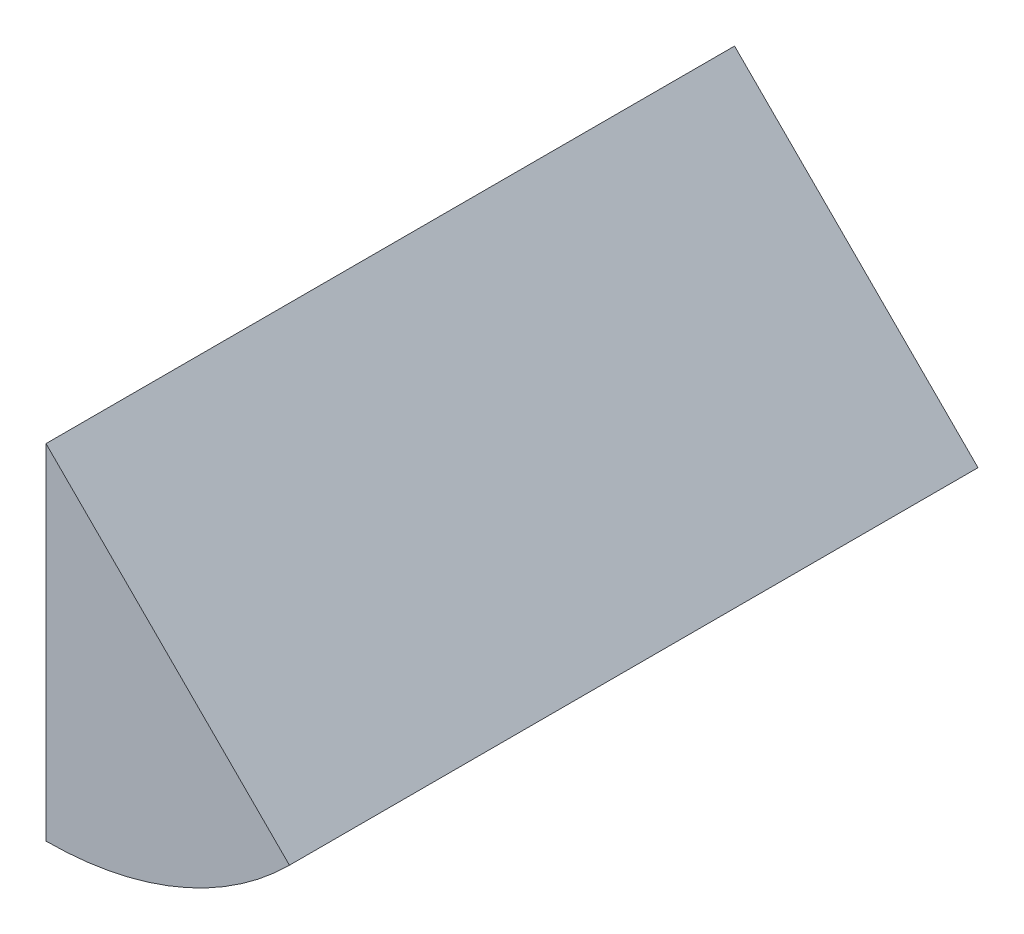
ISO-10303-21;
HEADER;
FILE_DESCRIPTION(('STEP AP214'),'2;1');
FILE_NAME('part.step','',(''),(''),'','','');
FILE_SCHEMA(('AUTOMOTIVE_DESIGN { 1 0 10303 214 1 1 1 1 }'));
ENDSEC;
DATA;
#1=APPLICATION_CONTEXT('core data for automotive mechanical design processes');
#2=APPLICATION_PROTOCOL_DEFINITION('international standard','automotive_design',2000,#1);
#3=PRODUCT_CONTEXT('',#1,'mechanical');
#4=PRODUCT('Part','Part','',(#3));
#5=PRODUCT_RELATED_PRODUCT_CATEGORY('part','',(#4));
#6=PRODUCT_DEFINITION_FORMATION('','',#4);
#7=PRODUCT_DEFINITION_CONTEXT('part definition',#1,'design');
#8=PRODUCT_DEFINITION('design','',#6,#7);
#9=PRODUCT_DEFINITION_SHAPE('','',#8);
#10=(LENGTH_UNIT() NAMED_UNIT(*) SI_UNIT(.MILLI.,.METRE.));
#11=(NAMED_UNIT(*) PLANE_ANGLE_UNIT() SI_UNIT($,.RADIAN.));
#12=(NAMED_UNIT(*) SI_UNIT($,.STERADIAN.) SOLID_ANGLE_UNIT());
#13=UNCERTAINTY_MEASURE_WITH_UNIT(LENGTH_MEASURE(1.E-05),#10,'distance_accuracy_value','');
#14=(GEOMETRIC_REPRESENTATION_CONTEXT(3) GLOBAL_UNCERTAINTY_ASSIGNED_CONTEXT((#13)) GLOBAL_UNIT_ASSIGNED_CONTEXT((#10,
#11,#12)) REPRESENTATION_CONTEXT('',''));
#15=CARTESIAN_POINT('',(0.,0.,0.));
#16=DIRECTION('',(0.,0.,1.));
#17=DIRECTION('',(1.,0.,0.));
#18=AXIS2_PLACEMENT_3D('',#15,#16,#17);
#19=CARTESIAN_POINT('',(0.,0.,50.));
#20=DIRECTION('',(-0.707106781186544,-0.707106781186551,0.));
#21=DIRECTION('',(0.707106781186551,-0.707106781186544,0.));
#22=AXIS2_PLACEMENT_3D('',#19,#20,#21);
#23=PLANE('',#22);
#24=DIRECTION('',(-0.707106781186551,0.707106781186544,0.));
#25=VECTOR('',#24,1.);
#26=CARTESIAN_POINT('',(0.,0.,0.));
#27=LINE('',#26,#25);
#28=CARTESIAN_POINT('',(17.6776695296638,-17.6776695296636,0.));
#29=VERTEX_POINT('',#28);
#30=CARTESIAN_POINT('',(0.,0.,0.));
#31=VERTEX_POINT('',#30);
#32=EDGE_CURVE('E80',#29,#31,#27,.T.);
#33=ORIENTED_EDGE('',*,*,#32,.T.);
#34=DIRECTION('',(0.,0.,-1.));
#35=VECTOR('',#34,1.);
#36=CARTESIAN_POINT('',(0.,0.,50.));
#37=LINE('',#36,#35);
#38=CARTESIAN_POINT('',(0.,0.,50.));
#39=VERTEX_POINT('',#38);
#40=EDGE_CURVE('E11',#39,#31,#37,.T.);
#41=ORIENTED_EDGE('',*,*,#40,.F.);
#42=DIRECTION('',(-0.707106781186551,0.707106781186544,0.));
#43=VECTOR('',#42,1.);
#44=CARTESIAN_POINT('',(0.,0.,50.));
#45=LINE('',#44,#43);
#46=CARTESIAN_POINT('',(17.6776695296638,-17.6776695296636,50.));
#47=VERTEX_POINT('',#46);
#48=EDGE_CURVE('E73',#47,#39,#45,.T.);
#49=ORIENTED_EDGE('',*,*,#48,.F.);
#50=DIRECTION('',(0.,0.,-1.));
#51=VECTOR('',#50,1.);
#52=CARTESIAN_POINT('',(17.6776695296638,-17.6776695296636,50.));
#53=LINE('',#52,#51);
#54=EDGE_CURVE('E81',#47,#29,#53,.T.);
#55=ORIENTED_EDGE('',*,*,#54,.T.);
#56=EDGE_LOOP('',(#33,#41,#49,#55));
#57=FACE_BOUND('',#56,.T.);
#58=ADVANCED_FACE('F33',(#57),#23,.F.);
#59=CARTESIAN_POINT('',(0.,0.,50.));
#60=DIRECTION('',(1.,0.,0.));
#61=DIRECTION('',(0.,0.,-1.));
#62=AXIS2_PLACEMENT_3D('',#59,#60,#61);
#63=PLANE('',#62);
#64=DIRECTION('',(0.,-1.,0.));
#65=VECTOR('',#64,1.);
#66=CARTESIAN_POINT('',(0.,0.,0.));
#67=LINE('',#66,#65);
#68=CARTESIAN_POINT('',(0.,-25.,0.));
#69=VERTEX_POINT('',#68);
#70=EDGE_CURVE('E61',#31,#69,#67,.T.);
#71=ORIENTED_EDGE('',*,*,#70,.T.);
#72=DIRECTION('',(0.,0.,-1.));
#73=VECTOR('',#72,1.);
#74=CARTESIAN_POINT('',(0.,-25.,50.));
#75=LINE('',#74,#73);
#76=CARTESIAN_POINT('',(0.,-25.,50.));
#77=VERTEX_POINT('',#76);
#78=EDGE_CURVE('E41',#77,#69,#75,.T.);
#79=ORIENTED_EDGE('',*,*,#78,.F.);
#80=DIRECTION('',(0.,-1.,0.));
#81=VECTOR('',#80,1.);
#82=CARTESIAN_POINT('',(0.,0.,50.));
#83=LINE('',#82,#81);
#84=EDGE_CURVE('E69',#39,#77,#83,.T.);
#85=ORIENTED_EDGE('',*,*,#84,.F.);
#86=ORIENTED_EDGE('',*,*,#40,.T.);
#87=EDGE_LOOP('',(#71,#79,#85,#86));
#88=FACE_BOUND('',#87,.T.);
#89=ADVANCED_FACE('F70',(#88),#63,.F.);
#90=CARTESIAN_POINT('',(0.,0.,50.));
#91=DIRECTION('',(0.,0.,-1.));
#92=DIRECTION('',(-1.,0.,0.));
#93=AXIS2_PLACEMENT_3D('',#90,#91,#92);
#94=CYLINDRICAL_SURFACE('',#93,25.);
#95=CARTESIAN_POINT('',(0.,0.,0.));
#96=DIRECTION('',(0.,0.,1.));
#97=DIRECTION('',(1.,0.,0.));
#98=AXIS2_PLACEMENT_3D('',#95,#96,#97);
#99=CIRCLE('',#98,25.);
#100=EDGE_CURVE('E66',#69,#29,#99,.T.);
#101=ORIENTED_EDGE('',*,*,#100,.T.);
#102=ORIENTED_EDGE('',*,*,#54,.F.);
#103=CARTESIAN_POINT('',(0.,0.,50.));
#104=DIRECTION('',(0.,0.,1.));
#105=DIRECTION('',(1.,0.,0.));
#106=AXIS2_PLACEMENT_3D('',#103,#104,#105);
#107=CIRCLE('',#106,25.);
#108=EDGE_CURVE('E49',#77,#47,#107,.T.);
#109=ORIENTED_EDGE('',*,*,#108,.F.);
#110=ORIENTED_EDGE('',*,*,#78,.T.);
#111=EDGE_LOOP('',(#101,#102,#109,#110));
#112=FACE_BOUND('',#111,.T.);
#113=ADVANCED_FACE('F92',(#112),#94,.T.);
#114=CARTESIAN_POINT('',(0.,0.,50.));
#115=DIRECTION('',(0.,0.,1.));
#116=DIRECTION('',(1.,0.,0.));
#117=AXIS2_PLACEMENT_3D('',#114,#115,#116);
#118=PLANE('',#117);
#119=ORIENTED_EDGE('',*,*,#48,.T.);
#120=ORIENTED_EDGE('',*,*,#84,.T.);
#121=ORIENTED_EDGE('',*,*,#108,.T.);
#122=EDGE_LOOP('',(#119,#120,#121));
#123=FACE_BOUND('',#122,.T.);
#124=ADVANCED_FACE('F76',(#123),#118,.T.);
#125=CARTESIAN_POINT('',(0.,0.,0.));
#126=DIRECTION('',(0.,0.,1.));
#127=DIRECTION('',(1.,0.,0.));
#128=AXIS2_PLACEMENT_3D('',#125,#126,#127);
#129=PLANE('',#128);
#130=CARTESIAN_POINT('',(6.75316806187616,-16.4372044421936,0.));
#131=DIRECTION('',(0.,0.,-1.));
#132=DIRECTION('',(-1.,0.,0.));
#133=AXIS2_PLACEMENT_3D('',#130,#131,#132);
#134=CIRCLE('',#133,5.);
#135=CARTESIAN_POINT('',(1.75316806187616,-16.4372044421936,0.));
#136=VERTEX_POINT('',#135);
#137=EDGE_CURVE('E87',#136,#136,#134,.T.);
#138=ORIENTED_EDGE('',*,*,#137,.F.);
#139=EDGE_LOOP('',(#138));
#140=FACE_BOUND('',#139,.T.);
#141=ORIENTED_EDGE('',*,*,#32,.F.);
#142=ORIENTED_EDGE('',*,*,#100,.F.);
#143=ORIENTED_EDGE('',*,*,#70,.F.);
#144=EDGE_LOOP('',(#141,#142,#143));
#145=FACE_BOUND('',#144,.T.);
#146=ADVANCED_FACE('F93',(#140,#145),#129,.F.);
#147=CARTESIAN_POINT('',(6.75316806187616,-16.4372044421936,10.));
#148=DIRECTION('',(0.,0.,-1.));
#149=DIRECTION('',(-1.,0.,0.));
#150=AXIS2_PLACEMENT_3D('',#147,#148,#149);
#151=CYLINDRICAL_SURFACE('',#150,5.);
#152=CARTESIAN_POINT('',(6.75316806187616,-16.4372044421936,10.));
#153=DIRECTION('',(0.,0.,-1.));
#154=DIRECTION('',(-1.,0.,0.));
#155=AXIS2_PLACEMENT_3D('',#152,#153,#154);
#156=CIRCLE('',#155,5.);
#157=CARTESIAN_POINT('',(1.75316806187616,-16.4372044421936,10.));
#158=VERTEX_POINT('',#157);
#159=EDGE_CURVE('E83',#158,#158,#156,.T.);
#160=ORIENTED_EDGE('',*,*,#159,.F.);
#161=EDGE_LOOP('',(#160));
#162=FACE_BOUND('',#161,.T.);
#163=ORIENTED_EDGE('',*,*,#137,.T.);
#164=EDGE_LOOP('',(#163));
#165=FACE_BOUND('',#164,.T.);
#166=ADVANCED_FACE('F95',(#162,#165),#151,.F.);
#167=CARTESIAN_POINT('',(6.75316806187616,-16.4372044421936,10.));
#168=DIRECTION('',(0.,0.,-1.));
#169=DIRECTION('',(-1.,0.,0.));
#170=AXIS2_PLACEMENT_3D('',#167,#168,#169);
#171=PLANE('',#170);
#172=ORIENTED_EDGE('',*,*,#159,.T.);
#173=EDGE_LOOP('',(#172));
#174=FACE_BOUND('',#173,.T.);
#175=ADVANCED_FACE('F102',(#174),#171,.T.);
#176=CLOSED_SHELL('',(#58,#89,#113,#124,#146,#166,#175));
#177=MANIFOLD_SOLID_BREP('B2',#176);
#178=ADVANCED_BREP_SHAPE_REPRESENTATION('',(#18,#177),#14);
#179=SHAPE_DEFINITION_REPRESENTATION(#9,#178);
ENDSEC;
END-ISO-10303-21;
